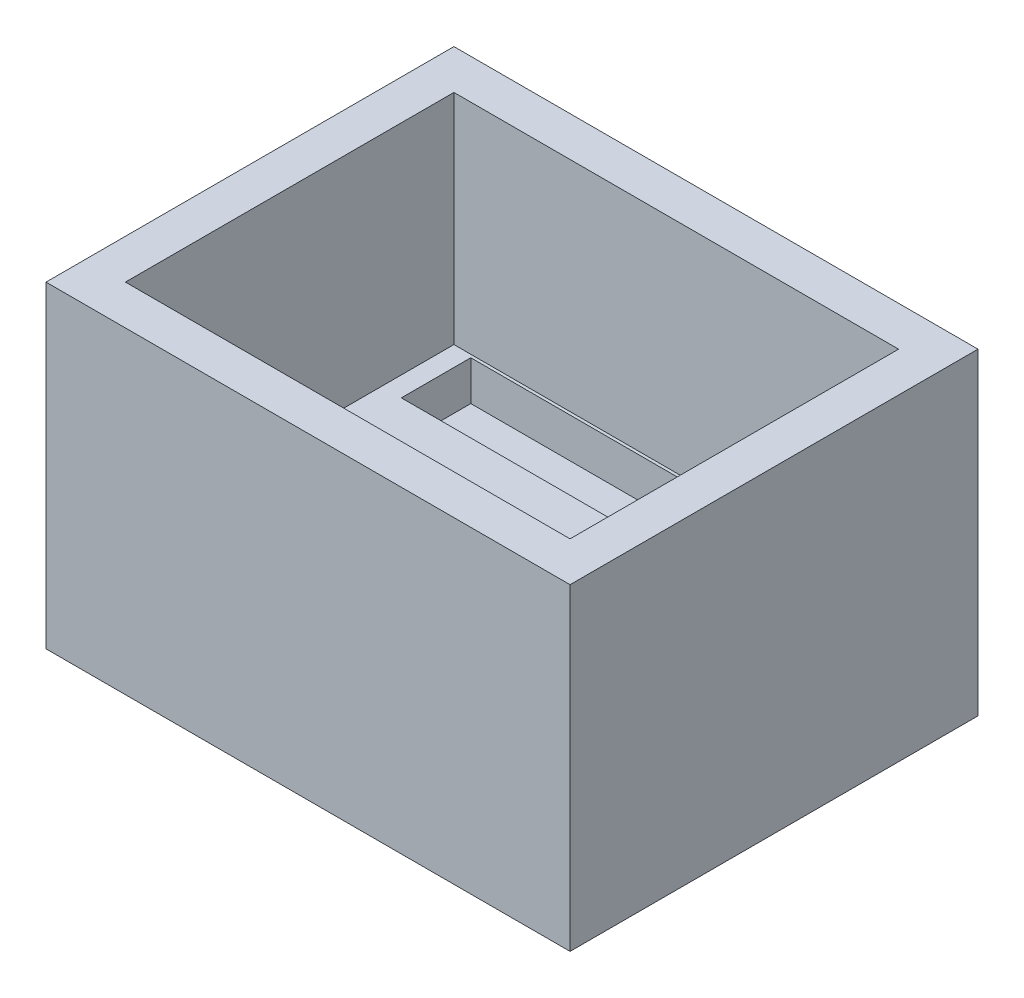
ISO-10303-21;
HEADER;
FILE_DESCRIPTION(('STEP AP214'),'2;1');
FILE_NAME('part.step','',(''),(''),'','','');
FILE_SCHEMA(('AUTOMOTIVE_DESIGN { 1 0 10303 214 1 1 1 1 }'));
ENDSEC;
DATA;
#1=APPLICATION_CONTEXT('core data for automotive mechanical design processes');
#2=APPLICATION_PROTOCOL_DEFINITION('international standard','automotive_design',2000,#1);
#3=PRODUCT_CONTEXT('',#1,'mechanical');
#4=PRODUCT('Part','Part','',(#3));
#5=PRODUCT_RELATED_PRODUCT_CATEGORY('part','',(#4));
#6=PRODUCT_DEFINITION_FORMATION('','',#4);
#7=PRODUCT_DEFINITION_CONTEXT('part definition',#1,'design');
#8=PRODUCT_DEFINITION('design','',#6,#7);
#9=PRODUCT_DEFINITION_SHAPE('','',#8);
#10=(LENGTH_UNIT() NAMED_UNIT(*) SI_UNIT(.MILLI.,.METRE.));
#11=(NAMED_UNIT(*) PLANE_ANGLE_UNIT() SI_UNIT($,.RADIAN.));
#12=(NAMED_UNIT(*) SI_UNIT($,.STERADIAN.) SOLID_ANGLE_UNIT());
#13=UNCERTAINTY_MEASURE_WITH_UNIT(LENGTH_MEASURE(1.E-05),#10,'distance_accuracy_value','');
#14=(GEOMETRIC_REPRESENTATION_CONTEXT(3) GLOBAL_UNCERTAINTY_ASSIGNED_CONTEXT((#13)) GLOBAL_UNIT_ASSIGNED_CONTEXT((#10,
#11,#12)) REPRESENTATION_CONTEXT('',''));
#15=CARTESIAN_POINT('',(0.,0.,0.));
#16=DIRECTION('',(0.,0.,1.));
#17=DIRECTION('',(1.,0.,0.));
#18=AXIS2_PLACEMENT_3D('',#15,#16,#17);
#19=CARTESIAN_POINT('',(0.,5.,0.));
#20=DIRECTION('',(0.,1.,0.));
#21=DIRECTION('',(0.,0.,1.));
#22=AXIS2_PLACEMENT_3D('',#19,#20,#21);
#23=PLANE('',#22);
#24=DIRECTION('',(0.,0.,1.));
#25=VECTOR('',#24,1.);
#26=CARTESIAN_POINT('',(-10.2,5.,-8.125));
#27=LINE('',#26,#25);
#28=CARTESIAN_POINT('',(-10.2,5.,-8.125));
#29=VERTEX_POINT('',#28);
#30=CARTESIAN_POINT('',(-10.2,5.,-4.625));
#31=VERTEX_POINT('',#30);
#32=EDGE_CURVE('E138',#29,#31,#27,.T.);
#33=ORIENTED_EDGE('',*,*,#32,.F.);
#34=DIRECTION('',(-1.,0.,0.));
#35=VECTOR('',#34,1.);
#36=CARTESIAN_POINT('',(-10.2,5.,-8.125));
#37=LINE('',#36,#35);
#38=CARTESIAN_POINT('',(10.2,5.,-8.125));
#39=VERTEX_POINT('',#38);
#40=EDGE_CURVE('E279',#39,#29,#37,.T.);
#41=ORIENTED_EDGE('',*,*,#40,.F.);
#42=DIRECTION('',(0.,0.,-1.));
#43=VECTOR('',#42,1.);
#44=CARTESIAN_POINT('',(10.2,5.,-8.125));
#45=LINE('',#44,#43);
#46=CARTESIAN_POINT('',(10.2,5.,-4.625));
#47=VERTEX_POINT('',#46);
#48=EDGE_CURVE('E293',#47,#39,#45,.T.);
#49=ORIENTED_EDGE('',*,*,#48,.F.);
#50=DIRECTION('',(1.,0.,0.));
#51=VECTOR('',#50,1.);
#52=CARTESIAN_POINT('',(-10.2,5.,-4.625));
#53=LINE('',#52,#51);
#54=EDGE_CURVE('E290',#31,#47,#53,.T.);
#55=ORIENTED_EDGE('',*,*,#54,.F.);
#56=EDGE_LOOP('',(#33,#41,#49,#55));
#57=FACE_BOUND('',#56,.T.);
#58=DIRECTION('',(0.,0.,1.));
#59=VECTOR('',#58,1.);
#60=CARTESIAN_POINT('',(-11.2,5.,0.));
#61=LINE('',#60,#59);
#62=CARTESIAN_POINT('',(-11.2,5.,-8.275));
#63=VERTEX_POINT('',#62);
#64=CARTESIAN_POINT('',(-11.2,5.,8.275));
#65=VERTEX_POINT('',#64);
#66=EDGE_CURVE('E306',#63,#65,#61,.T.);
#67=ORIENTED_EDGE('',*,*,#66,.T.);
#68=DIRECTION('',(1.,0.,0.));
#69=VECTOR('',#68,1.);
#70=CARTESIAN_POINT('',(0.,5.,8.275));
#71=LINE('',#70,#69);
#72=CARTESIAN_POINT('',(11.2,5.,8.275));
#73=VERTEX_POINT('',#72);
#74=EDGE_CURVE('E130',#65,#73,#71,.T.);
#75=ORIENTED_EDGE('',*,*,#74,.T.);
#76=DIRECTION('',(0.,0.,-1.));
#77=VECTOR('',#76,1.);
#78=CARTESIAN_POINT('',(11.2,5.,0.));
#79=LINE('',#78,#77);
#80=CARTESIAN_POINT('',(11.2,5.,-8.275));
#81=VERTEX_POINT('',#80);
#82=EDGE_CURVE('E308',#73,#81,#79,.T.);
#83=ORIENTED_EDGE('',*,*,#82,.T.);
#84=DIRECTION('',(-1.,0.,0.));
#85=VECTOR('',#84,1.);
#86=CARTESIAN_POINT('',(0.,5.,-8.27499999999999));
#87=LINE('',#86,#85);
#88=EDGE_CURVE('E12',#81,#63,#87,.T.);
#89=ORIENTED_EDGE('',*,*,#88,.T.);
#90=EDGE_LOOP('',(#67,#75,#83,#89));
#91=FACE_BOUND('',#90,.T.);
#92=CARTESIAN_POINT('',(-7.65,5.,5.525));
#93=DIRECTION('',(0.,1.,0.));
#94=DIRECTION('',(0.,0.,1.));
#95=AXIS2_PLACEMENT_3D('',#92,#93,#94);
#96=CIRCLE('',#95,1.55);
#97=CARTESIAN_POINT('',(-7.65,5.,7.075));
#98=VERTEX_POINT('',#97);
#99=EDGE_CURVE('E312',#98,#98,#96,.T.);
#100=ORIENTED_EDGE('',*,*,#99,.F.);
#101=EDGE_LOOP('',(#100));
#102=FACE_BOUND('',#101,.T.);
#103=CARTESIAN_POINT('',(7.65,5.,5.525));
#104=DIRECTION('',(0.,1.,0.));
#105=DIRECTION('',(0.,0.,1.));
#106=AXIS2_PLACEMENT_3D('',#103,#104,#105);
#107=CIRCLE('',#106,1.55);
#108=CARTESIAN_POINT('',(7.65,5.,7.075));
#109=VERTEX_POINT('',#108);
#110=EDGE_CURVE('E313',#109,#109,#107,.T.);
#111=ORIENTED_EDGE('',*,*,#110,.F.);
#112=EDGE_LOOP('',(#111));
#113=FACE_BOUND('',#112,.T.);
#114=ADVANCED_FACE('F121',(#57,#91,#102,#113),#23,.T.);
#115=CARTESIAN_POINT('',(0.,0.,0.));
#116=DIRECTION('',(0.,1.,0.));
#117=DIRECTION('',(0.,0.,1.));
#118=AXIS2_PLACEMENT_3D('',#115,#116,#117);
#119=PLANE('',#118);
#120=CARTESIAN_POINT('',(-7.65,0.,5.525));
#121=DIRECTION('',(0.,1.,0.));
#122=DIRECTION('',(0.,0.,1.));
#123=AXIS2_PLACEMENT_3D('',#120,#121,#122);
#124=CIRCLE('',#123,1.55);
#125=CARTESIAN_POINT('',(-7.65,0.,7.075));
#126=VERTEX_POINT('',#125);
#127=EDGE_CURVE('E125',#126,#126,#124,.T.);
#128=ORIENTED_EDGE('',*,*,#127,.T.);
#129=EDGE_LOOP('',(#128));
#130=FACE_BOUND('',#129,.T.);
#131=CARTESIAN_POINT('',(7.65,0.,5.525));
#132=DIRECTION('',(0.,1.,0.));
#133=DIRECTION('',(0.,0.,1.));
#134=AXIS2_PLACEMENT_3D('',#131,#132,#133);
#135=CIRCLE('',#134,1.55);
#136=CARTESIAN_POINT('',(7.65,0.,7.075));
#137=VERTEX_POINT('',#136);
#138=EDGE_CURVE('E300',#137,#137,#135,.T.);
#139=ORIENTED_EDGE('',*,*,#138,.T.);
#140=EDGE_LOOP('',(#139));
#141=FACE_BOUND('',#140,.T.);
#142=DIRECTION('',(-1.,0.,0.));
#143=VECTOR('',#142,1.);
#144=CARTESIAN_POINT('',(13.2,0.,10.275));
#145=LINE('',#144,#143);
#146=CARTESIAN_POINT('',(13.2,0.,10.275));
#147=VERTEX_POINT('',#146);
#148=CARTESIAN_POINT('',(-13.2,0.,10.275));
#149=VERTEX_POINT('',#148);
#150=EDGE_CURVE('E239',#147,#149,#145,.T.);
#151=ORIENTED_EDGE('',*,*,#150,.T.);
#152=DIRECTION('',(0.,0.,-1.));
#153=VECTOR('',#152,1.);
#154=CARTESIAN_POINT('',(-13.2,0.,10.275));
#155=LINE('',#154,#153);
#156=CARTESIAN_POINT('',(-13.2,0.,-10.275));
#157=VERTEX_POINT('',#156);
#158=EDGE_CURVE('E260',#149,#157,#155,.T.);
#159=ORIENTED_EDGE('',*,*,#158,.T.);
#160=DIRECTION('',(1.,0.,0.));
#161=VECTOR('',#160,1.);
#162=CARTESIAN_POINT('',(-13.2,0.,-10.275));
#163=LINE('',#162,#161);
#164=CARTESIAN_POINT('',(13.2,0.,-10.275));
#165=VERTEX_POINT('',#164);
#166=EDGE_CURVE('E263',#157,#165,#163,.T.);
#167=ORIENTED_EDGE('',*,*,#166,.T.);
#168=DIRECTION('',(0.,0.,1.));
#169=VECTOR('',#168,1.);
#170=CARTESIAN_POINT('',(13.2,0.,-10.275));
#171=LINE('',#170,#169);
#172=EDGE_CURVE('E248',#165,#147,#171,.T.);
#173=ORIENTED_EDGE('',*,*,#172,.T.);
#174=EDGE_LOOP('',(#151,#159,#167,#173));
#175=FACE_BOUND('',#174,.T.);
#176=ADVANCED_FACE('F323',(#130,#141,#175),#119,.F.);
#177=CARTESIAN_POINT('',(7.65,5.,5.525));
#178=DIRECTION('',(0.,-1.,0.));
#179=DIRECTION('',(0.,0.,-1.));
#180=AXIS2_PLACEMENT_3D('',#177,#178,#179);
#181=CYLINDRICAL_SURFACE('',#180,1.55);
#182=ORIENTED_EDGE('',*,*,#110,.T.);
#183=EDGE_LOOP('',(#182));
#184=FACE_BOUND('',#183,.T.);
#185=ORIENTED_EDGE('',*,*,#138,.F.);
#186=EDGE_LOOP('',(#185));
#187=FACE_BOUND('',#186,.T.);
#188=ADVANCED_FACE('F328',(#184,#187),#181,.F.);
#189=CARTESIAN_POINT('',(-7.65,5.,5.525));
#190=DIRECTION('',(0.,-1.,0.));
#191=DIRECTION('',(0.,0.,-1.));
#192=AXIS2_PLACEMENT_3D('',#189,#190,#191);
#193=CYLINDRICAL_SURFACE('',#192,1.55);
#194=ORIENTED_EDGE('',*,*,#99,.T.);
#195=EDGE_LOOP('',(#194));
#196=FACE_BOUND('',#195,.T.);
#197=ORIENTED_EDGE('',*,*,#127,.F.);
#198=EDGE_LOOP('',(#197));
#199=FACE_BOUND('',#198,.T.);
#200=ADVANCED_FACE('F123',(#196,#199),#193,.F.);
#201=CARTESIAN_POINT('',(-10.2,3.,-8.125));
#202=DIRECTION('',(-1.,0.,0.));
#203=DIRECTION('',(0.,0.,1.));
#204=AXIS2_PLACEMENT_3D('',#201,#202,#203);
#205=PLANE('',#204);
#206=ORIENTED_EDGE('',*,*,#32,.T.);
#207=DIRECTION('',(0.,1.,0.));
#208=VECTOR('',#207,1.);
#209=CARTESIAN_POINT('',(-10.2,3.,-4.625));
#210=LINE('',#209,#208);
#211=CARTESIAN_POINT('',(-10.2,3.,-4.625));
#212=VERTEX_POINT('',#211);
#213=EDGE_CURVE('E288',#212,#31,#210,.T.);
#214=ORIENTED_EDGE('',*,*,#213,.F.);
#215=DIRECTION('',(0.,0.,1.));
#216=VECTOR('',#215,1.);
#217=CARTESIAN_POINT('',(-10.2,3.,-8.125));
#218=LINE('',#217,#216);
#219=CARTESIAN_POINT('',(-10.2,3.,-8.125));
#220=VERTEX_POINT('',#219);
#221=EDGE_CURVE('E275',#220,#212,#218,.T.);
#222=ORIENTED_EDGE('',*,*,#221,.F.);
#223=DIRECTION('',(0.,1.,0.));
#224=VECTOR('',#223,1.);
#225=CARTESIAN_POINT('',(-10.2,3.,-8.125));
#226=LINE('',#225,#224);
#227=EDGE_CURVE('E298',#220,#29,#226,.T.);
#228=ORIENTED_EDGE('',*,*,#227,.T.);
#229=EDGE_LOOP('',(#206,#214,#222,#228));
#230=FACE_BOUND('',#229,.T.);
#231=ADVANCED_FACE('F327',(#230),#205,.F.);
#232=CARTESIAN_POINT('',(-10.2,3.,-8.125));
#233=DIRECTION('',(0.,0.,-1.));
#234=DIRECTION('',(-1.,0.,0.));
#235=AXIS2_PLACEMENT_3D('',#232,#233,#234);
#236=PLANE('',#235);
#237=ORIENTED_EDGE('',*,*,#40,.T.);
#238=ORIENTED_EDGE('',*,*,#227,.F.);
#239=DIRECTION('',(-1.,0.,0.));
#240=VECTOR('',#239,1.);
#241=CARTESIAN_POINT('',(-10.2,3.,-8.125));
#242=LINE('',#241,#240);
#243=CARTESIAN_POINT('',(10.2,3.,-8.125));
#244=VERTEX_POINT('',#243);
#245=EDGE_CURVE('E285',#244,#220,#242,.T.);
#246=ORIENTED_EDGE('',*,*,#245,.F.);
#247=DIRECTION('',(0.,1.,0.));
#248=VECTOR('',#247,1.);
#249=CARTESIAN_POINT('',(10.2,3.,-8.125));
#250=LINE('',#249,#248);
#251=EDGE_CURVE('E301',#244,#39,#250,.T.);
#252=ORIENTED_EDGE('',*,*,#251,.T.);
#253=EDGE_LOOP('',(#237,#238,#246,#252));
#254=FACE_BOUND('',#253,.T.);
#255=ADVANCED_FACE('F333',(#254),#236,.F.);
#256=CARTESIAN_POINT('',(10.2,3.,-8.125));
#257=DIRECTION('',(1.,0.,0.));
#258=DIRECTION('',(0.,0.,-1.));
#259=AXIS2_PLACEMENT_3D('',#256,#257,#258);
#260=PLANE('',#259);
#261=ORIENTED_EDGE('',*,*,#48,.T.);
#262=ORIENTED_EDGE('',*,*,#251,.F.);
#263=DIRECTION('',(0.,0.,-1.));
#264=VECTOR('',#263,1.);
#265=CARTESIAN_POINT('',(10.2,3.,-8.125));
#266=LINE('',#265,#264);
#267=CARTESIAN_POINT('',(10.2,3.,-4.625));
#268=VERTEX_POINT('',#267);
#269=EDGE_CURVE('E282',#268,#244,#266,.T.);
#270=ORIENTED_EDGE('',*,*,#269,.F.);
#271=DIRECTION('',(0.,1.,0.));
#272=VECTOR('',#271,1.);
#273=CARTESIAN_POINT('',(10.2,3.,-4.625));
#274=LINE('',#273,#272);
#275=EDGE_CURVE('E303',#268,#47,#274,.T.);
#276=ORIENTED_EDGE('',*,*,#275,.T.);
#277=EDGE_LOOP('',(#261,#262,#270,#276));
#278=FACE_BOUND('',#277,.T.);
#279=ADVANCED_FACE('F353',(#278),#260,.F.);
#280=CARTESIAN_POINT('',(-10.2,3.,-4.625));
#281=DIRECTION('',(0.,0.,1.));
#282=DIRECTION('',(1.,0.,0.));
#283=AXIS2_PLACEMENT_3D('',#280,#281,#282);
#284=PLANE('',#283);
#285=ORIENTED_EDGE('',*,*,#54,.T.);
#286=ORIENTED_EDGE('',*,*,#275,.F.);
#287=DIRECTION('',(1.,0.,0.));
#288=VECTOR('',#287,1.);
#289=CARTESIAN_POINT('',(-10.2,3.,-4.625));
#290=LINE('',#289,#288);
#291=EDGE_CURVE('E278',#212,#268,#290,.T.);
#292=ORIENTED_EDGE('',*,*,#291,.F.);
#293=ORIENTED_EDGE('',*,*,#213,.T.);
#294=EDGE_LOOP('',(#285,#286,#292,#293));
#295=FACE_BOUND('',#294,.T.);
#296=ADVANCED_FACE('F349',(#295),#284,.F.);
#297=CARTESIAN_POINT('',(0.,3.,0.));
#298=DIRECTION('',(0.,1.,0.));
#299=DIRECTION('',(0.,0.,1.));
#300=AXIS2_PLACEMENT_3D('',#297,#298,#299);
#301=PLANE('',#300);
#302=ORIENTED_EDGE('',*,*,#221,.T.);
#303=ORIENTED_EDGE('',*,*,#291,.T.);
#304=ORIENTED_EDGE('',*,*,#269,.T.);
#305=ORIENTED_EDGE('',*,*,#245,.T.);
#306=EDGE_LOOP('',(#302,#303,#304,#305));
#307=FACE_BOUND('',#306,.T.);
#308=ADVANCED_FACE('F352',(#307),#301,.T.);
#309=CARTESIAN_POINT('',(13.2,16.,10.275));
#310=DIRECTION('',(0.,0.,1.));
#311=DIRECTION('',(1.,0.,0.));
#312=AXIS2_PLACEMENT_3D('',#309,#310,#311);
#313=PLANE('',#312);
#314=ORIENTED_EDGE('',*,*,#150,.F.);
#315=DIRECTION('',(0.,-1.,0.));
#316=VECTOR('',#315,1.);
#317=CARTESIAN_POINT('',(13.2,16.,10.275));
#318=LINE('',#317,#316);
#319=CARTESIAN_POINT('',(13.2,16.,10.275));
#320=VERTEX_POINT('',#319);
#321=EDGE_CURVE('E268',#320,#147,#318,.T.);
#322=ORIENTED_EDGE('',*,*,#321,.F.);
#323=DIRECTION('',(-1.,0.,0.));
#324=VECTOR('',#323,1.);
#325=CARTESIAN_POINT('',(13.2,16.,10.275));
#326=LINE('',#325,#324);
#327=CARTESIAN_POINT('',(-13.2,16.,10.275));
#328=VERTEX_POINT('',#327);
#329=EDGE_CURVE('E244',#320,#328,#326,.T.);
#330=ORIENTED_EDGE('',*,*,#329,.T.);
#331=DIRECTION('',(0.,-1.,0.));
#332=VECTOR('',#331,1.);
#333=CARTESIAN_POINT('',(-13.2,16.,10.275));
#334=LINE('',#333,#332);
#335=EDGE_CURVE('E257',#328,#149,#334,.T.);
#336=ORIENTED_EDGE('',*,*,#335,.T.);
#337=EDGE_LOOP('',(#314,#322,#330,#336));
#338=FACE_BOUND('',#337,.T.);
#339=ADVANCED_FACE('F362',(#338),#313,.T.);
#340=CARTESIAN_POINT('',(13.2,16.,-10.275));
#341=DIRECTION('',(1.,0.,0.));
#342=DIRECTION('',(0.,0.,-1.));
#343=AXIS2_PLACEMENT_3D('',#340,#341,#342);
#344=PLANE('',#343);
#345=ORIENTED_EDGE('',*,*,#172,.F.);
#346=DIRECTION('',(0.,-1.,0.));
#347=VECTOR('',#346,1.);
#348=CARTESIAN_POINT('',(13.2,16.,-10.275));
#349=LINE('',#348,#347);
#350=CARTESIAN_POINT('',(13.2,16.,-10.275));
#351=VERTEX_POINT('',#350);
#352=EDGE_CURVE('E270',#351,#165,#349,.T.);
#353=ORIENTED_EDGE('',*,*,#352,.F.);
#354=DIRECTION('',(0.,0.,1.));
#355=VECTOR('',#354,1.);
#356=CARTESIAN_POINT('',(13.2,16.,-10.275));
#357=LINE('',#356,#355);
#358=EDGE_CURVE('E254',#351,#320,#357,.T.);
#359=ORIENTED_EDGE('',*,*,#358,.T.);
#360=ORIENTED_EDGE('',*,*,#321,.T.);
#361=EDGE_LOOP('',(#345,#353,#359,#360));
#362=FACE_BOUND('',#361,.T.);
#363=ADVANCED_FACE('F366',(#362),#344,.T.);
#364=CARTESIAN_POINT('',(-13.2,16.,-10.275));
#365=DIRECTION('',(0.,0.,-1.));
#366=DIRECTION('',(-1.,0.,0.));
#367=AXIS2_PLACEMENT_3D('',#364,#365,#366);
#368=PLANE('',#367);
#369=ORIENTED_EDGE('',*,*,#166,.F.);
#370=DIRECTION('',(0.,-1.,0.));
#371=VECTOR('',#370,1.);
#372=CARTESIAN_POINT('',(-13.2,16.,-10.275));
#373=LINE('',#372,#371);
#374=CARTESIAN_POINT('',(-13.2,16.,-10.275));
#375=VERTEX_POINT('',#374);
#376=EDGE_CURVE('E272',#375,#157,#373,.T.);
#377=ORIENTED_EDGE('',*,*,#376,.F.);
#378=DIRECTION('',(1.,0.,0.));
#379=VECTOR('',#378,1.);
#380=CARTESIAN_POINT('',(-13.2,16.,-10.275));
#381=LINE('',#380,#379);
#382=EDGE_CURVE('E251',#375,#351,#381,.T.);
#383=ORIENTED_EDGE('',*,*,#382,.T.);
#384=ORIENTED_EDGE('',*,*,#352,.T.);
#385=EDGE_LOOP('',(#369,#377,#383,#384));
#386=FACE_BOUND('',#385,.T.);
#387=ADVANCED_FACE('F371',(#386),#368,.T.);
#388=CARTESIAN_POINT('',(-13.2,16.,10.275));
#389=DIRECTION('',(-1.,0.,0.));
#390=DIRECTION('',(0.,0.,1.));
#391=AXIS2_PLACEMENT_3D('',#388,#389,#390);
#392=PLANE('',#391);
#393=ORIENTED_EDGE('',*,*,#158,.F.);
#394=ORIENTED_EDGE('',*,*,#335,.F.);
#395=DIRECTION('',(0.,0.,-1.));
#396=VECTOR('',#395,1.);
#397=CARTESIAN_POINT('',(-13.2,16.,10.275));
#398=LINE('',#397,#396);
#399=EDGE_CURVE('E247',#328,#375,#398,.T.);
#400=ORIENTED_EDGE('',*,*,#399,.T.);
#401=ORIENTED_EDGE('',*,*,#376,.T.);
#402=EDGE_LOOP('',(#393,#394,#400,#401));
#403=FACE_BOUND('',#402,.T.);
#404=ADVANCED_FACE('F368',(#403),#392,.T.);
#405=CARTESIAN_POINT('',(0.,16.,0.));
#406=DIRECTION('',(0.,-1.,0.));
#407=DIRECTION('',(0.,0.,-1.));
#408=AXIS2_PLACEMENT_3D('',#405,#406,#407);
#409=PLANE('',#408);
#410=DIRECTION('',(0.,0.,1.));
#411=VECTOR('',#410,1.);
#412=CARTESIAN_POINT('',(11.2,16.,-8.275));
#413=LINE('',#412,#411);
#414=CARTESIAN_POINT('',(11.2,16.,-8.275));
#415=VERTEX_POINT('',#414);
#416=CARTESIAN_POINT('',(11.2,16.,8.275));
#417=VERTEX_POINT('',#416);
#418=EDGE_CURVE('E219',#415,#417,#413,.T.);
#419=ORIENTED_EDGE('',*,*,#418,.T.);
#420=DIRECTION('',(-1.,0.,0.));
#421=VECTOR('',#420,1.);
#422=CARTESIAN_POINT('',(11.2,16.,8.275));
#423=LINE('',#422,#421);
#424=CARTESIAN_POINT('',(-11.2,16.,8.275));
#425=VERTEX_POINT('',#424);
#426=EDGE_CURVE('E214',#417,#425,#423,.T.);
#427=ORIENTED_EDGE('',*,*,#426,.T.);
#428=DIRECTION('',(0.,0.,-1.));
#429=VECTOR('',#428,1.);
#430=CARTESIAN_POINT('',(-11.2,16.,8.275));
#431=LINE('',#430,#429);
#432=CARTESIAN_POINT('',(-11.2,16.,-8.275));
#433=VERTEX_POINT('',#432);
#434=EDGE_CURVE('E223',#425,#433,#431,.T.);
#435=ORIENTED_EDGE('',*,*,#434,.T.);
#436=DIRECTION('',(1.,0.,0.));
#437=VECTOR('',#436,1.);
#438=CARTESIAN_POINT('',(-11.2,16.,-8.275));
#439=LINE('',#438,#437);
#440=EDGE_CURVE('E228',#433,#415,#439,.T.);
#441=ORIENTED_EDGE('',*,*,#440,.T.);
#442=EDGE_LOOP('',(#419,#427,#435,#441));
#443=FACE_BOUND('',#442,.T.);
#444=ORIENTED_EDGE('',*,*,#329,.F.);
#445=ORIENTED_EDGE('',*,*,#358,.F.);
#446=ORIENTED_EDGE('',*,*,#382,.F.);
#447=ORIENTED_EDGE('',*,*,#399,.F.);
#448=EDGE_LOOP('',(#444,#445,#446,#447));
#449=FACE_BOUND('',#448,.T.);
#450=ADVANCED_FACE('F230',(#443,#449),#409,.F.);
#451=CARTESIAN_POINT('',(11.2,16.,8.275));
#452=DIRECTION('',(0.,0.,1.));
#453=DIRECTION('',(1.,0.,0.));
#454=AXIS2_PLACEMENT_3D('',#451,#452,#453);
#455=PLANE('',#454);
#456=ORIENTED_EDGE('',*,*,#74,.F.);
#457=DIRECTION('',(0.,-1.,0.));
#458=VECTOR('',#457,1.);
#459=CARTESIAN_POINT('',(-11.2,16.,8.275));
#460=LINE('',#459,#458);
#461=EDGE_CURVE('E146',#425,#65,#460,.T.);
#462=ORIENTED_EDGE('',*,*,#461,.F.);
#463=ORIENTED_EDGE('',*,*,#426,.F.);
#464=DIRECTION('',(0.,-1.,0.));
#465=VECTOR('',#464,1.);
#466=CARTESIAN_POINT('',(11.2,16.,8.275));
#467=LINE('',#466,#465);
#468=EDGE_CURVE('E237',#417,#73,#467,.T.);
#469=ORIENTED_EDGE('',*,*,#468,.T.);
#470=EDGE_LOOP('',(#456,#462,#463,#469));
#471=FACE_BOUND('',#470,.T.);
#472=ADVANCED_FACE('F211',(#471),#455,.F.);
#473=CARTESIAN_POINT('',(11.2,16.,-8.275));
#474=DIRECTION('',(1.,0.,0.));
#475=DIRECTION('',(0.,0.,-1.));
#476=AXIS2_PLACEMENT_3D('',#473,#474,#475);
#477=PLANE('',#476);
#478=ORIENTED_EDGE('',*,*,#82,.F.);
#479=ORIENTED_EDGE('',*,*,#468,.F.);
#480=ORIENTED_EDGE('',*,*,#418,.F.);
#481=DIRECTION('',(0.,-1.,0.));
#482=VECTOR('',#481,1.);
#483=CARTESIAN_POINT('',(11.2,16.,-8.275));
#484=LINE('',#483,#482);
#485=EDGE_CURVE('E240',#415,#81,#484,.T.);
#486=ORIENTED_EDGE('',*,*,#485,.T.);
#487=EDGE_LOOP('',(#478,#479,#480,#486));
#488=FACE_BOUND('',#487,.T.);
#489=ADVANCED_FACE('F383',(#488),#477,.F.);
#490=CARTESIAN_POINT('',(-11.2,16.,-8.275));
#491=DIRECTION('',(0.,0.,-1.));
#492=DIRECTION('',(-1.,0.,0.));
#493=AXIS2_PLACEMENT_3D('',#490,#491,#492);
#494=PLANE('',#493);
#495=ORIENTED_EDGE('',*,*,#88,.F.);
#496=ORIENTED_EDGE('',*,*,#485,.F.);
#497=ORIENTED_EDGE('',*,*,#440,.F.);
#498=DIRECTION('',(0.,-1.,0.));
#499=VECTOR('',#498,1.);
#500=CARTESIAN_POINT('',(-11.2,16.,-8.275));
#501=LINE('',#500,#499);
#502=EDGE_CURVE('E218',#433,#63,#501,.T.);
#503=ORIENTED_EDGE('',*,*,#502,.T.);
#504=EDGE_LOOP('',(#495,#496,#497,#503));
#505=FACE_BOUND('',#504,.T.);
#506=ADVANCED_FACE('F386',(#505),#494,.F.);
#507=CARTESIAN_POINT('',(-11.2,16.,8.275));
#508=DIRECTION('',(-1.,0.,0.));
#509=DIRECTION('',(0.,0.,1.));
#510=AXIS2_PLACEMENT_3D('',#507,#508,#509);
#511=PLANE('',#510);
#512=ORIENTED_EDGE('',*,*,#66,.F.);
#513=ORIENTED_EDGE('',*,*,#502,.F.);
#514=ORIENTED_EDGE('',*,*,#434,.F.);
#515=ORIENTED_EDGE('',*,*,#461,.T.);
#516=EDGE_LOOP('',(#512,#513,#514,#515));
#517=FACE_BOUND('',#516,.T.);
#518=ADVANCED_FACE('F224',(#517),#511,.F.);
#519=CLOSED_SHELL('',(#114,#176,#188,#200,#231,#255,#279,#296,#308,#339,#363,#387,#404,#450,
#472,#489,#506,#518));
#520=MANIFOLD_SOLID_BREP('B2',#519);
#521=ADVANCED_BREP_SHAPE_REPRESENTATION('',(#18,#520),#14);
#522=SHAPE_DEFINITION_REPRESENTATION(#9,#521);
ENDSEC;
END-ISO-10303-21;
